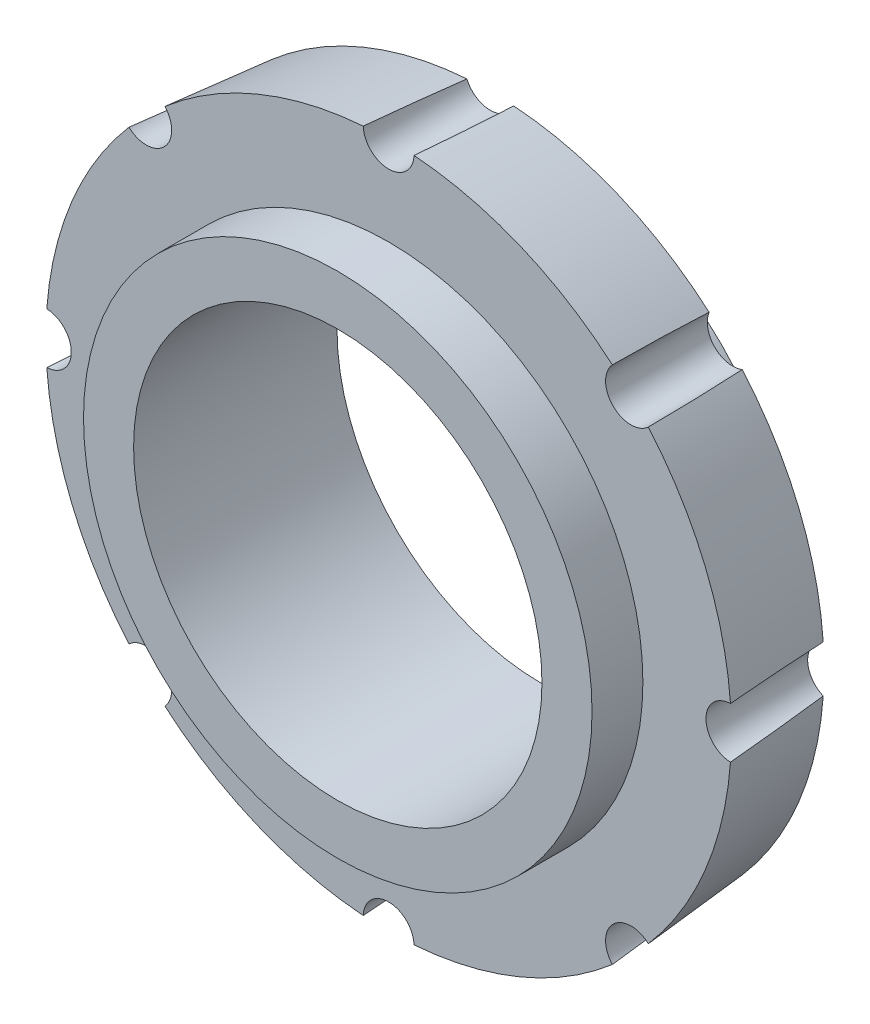
ISO-10303-21;
HEADER;
FILE_DESCRIPTION(('STEP AP214'),'2;1');
FILE_NAME('part.step','',(''),(''),'','','');
FILE_SCHEMA(('AUTOMOTIVE_DESIGN { 1 0 10303 214 1 1 1 1 }'));
ENDSEC;
DATA;
#1=APPLICATION_CONTEXT('core data for automotive mechanical design processes');
#2=APPLICATION_PROTOCOL_DEFINITION('international standard','automotive_design',2000,#1);
#3=PRODUCT_CONTEXT('',#1,'mechanical');
#4=PRODUCT('Part','Part','',(#3));
#5=PRODUCT_RELATED_PRODUCT_CATEGORY('part','',(#4));
#6=PRODUCT_DEFINITION_FORMATION('','',#4);
#7=PRODUCT_DEFINITION_CONTEXT('part definition',#1,'design');
#8=PRODUCT_DEFINITION('design','',#6,#7);
#9=PRODUCT_DEFINITION_SHAPE('','',#8);
#10=(LENGTH_UNIT() NAMED_UNIT(*) SI_UNIT(.MILLI.,.METRE.));
#11=(NAMED_UNIT(*) PLANE_ANGLE_UNIT() SI_UNIT($,.RADIAN.));
#12=(NAMED_UNIT(*) SI_UNIT($,.STERADIAN.) SOLID_ANGLE_UNIT());
#13=UNCERTAINTY_MEASURE_WITH_UNIT(LENGTH_MEASURE(1.E-05),#10,'distance_accuracy_value','');
#14=(GEOMETRIC_REPRESENTATION_CONTEXT(3) GLOBAL_UNCERTAINTY_ASSIGNED_CONTEXT((#13)) GLOBAL_UNIT_ASSIGNED_CONTEXT((#10,
#11,#12)) REPRESENTATION_CONTEXT('',''));
#15=CARTESIAN_POINT('',(0.,0.,0.));
#16=DIRECTION('',(0.,0.,1.));
#17=DIRECTION('',(1.,0.,0.));
#18=AXIS2_PLACEMENT_3D('',#15,#16,#17);
#19=CARTESIAN_POINT('',(0.,0.,-9.525));
#20=DIRECTION('',(0.,0.,1.));
#21=DIRECTION('',(1.,0.,0.));
#22=AXIS2_PLACEMENT_3D('',#19,#20,#21);
#23=CONICAL_SURFACE('',#22,20.83308,0.0891629633274056);
#24=CARTESIAN_POINT('',(0.,0.,-3.175));
#25=DIRECTION('',(0.,0.,1.));
#26=DIRECTION('',(1.,0.,0.));
#27=AXIS2_PLACEMENT_3D('',#24,#25,#26);
#28=CIRCLE('',#27,21.40077);
#29=CARTESIAN_POINT('',(13.9692354737796,16.2127547588619,-3.175));
#30=VERTEX_POINT('',#29);
#31=CARTESIAN_POINT('',(1.58640770020422,21.3418899632069,-3.175));
#32=VERTEX_POINT('',#31);
#33=EDGE_CURVE('E163',#30,#32,#28,.T.);
#34=ORIENTED_EDGE('',*,*,#33,.F.);
#35=CARTESIAN_POINT('',(13.9692476476736,16.2127678711169,-3.1748));
#36=CARTESIAN_POINT('',(13.9371745908084,16.1781990122594,-3.70190177075223));
#37=CARTESIAN_POINT('',(13.9066705156806,16.1422803863115,-4.22901091893696));
#38=CARTESIAN_POINT('',(13.8488628277287,16.0676898838869,-5.28317344568509));
#39=CARTESIAN_POINT('',(13.8215589960918,16.0290181959383,-5.81022682559679));
#40=CARTESIAN_POINT('',(13.7699972211603,15.9485311679141,-6.8686448932803));
#41=CARTESIAN_POINT('',(13.7457663809642,15.9066924416278,-7.40000913055283));
#42=CARTESIAN_POINT('',(13.7008137814249,15.8199611392416,-8.46267337602241));
#43=CARTESIAN_POINT('',(13.6800922643826,15.7750683525742,-8.99397337725553));
#44=CARTESIAN_POINT('',(13.6612252610128,15.7285537053998,-9.5252));
#45=B_SPLINE_CURVE_WITH_KNOTS('',3,(#35,#36,#37,#38,#39,#40,#41,#42,#43,#44),.UNSPECIFIED.,.F.,
.F.,(4,2,2,2,4),(0.,1.58761718683098,3.17512575888463,4.77578400100517,6.37655271536915),.UNSPECIFIED.);
#46=CARTESIAN_POINT('',(13.661232356679,15.7285712251058,-9.525));
#47=VERTEX_POINT('',#46);
#48=EDGE_CURVE('E150',#30,#47,#45,.T.);
#49=ORIENTED_EDGE('',*,*,#48,.T.);
#50=CARTESIAN_POINT('',(0.,0.,-9.525));
#51=DIRECTION('',(0.,0.,1.));
#52=DIRECTION('',(1.,0.,0.));
#53=AXIS2_PLACEMENT_3D('',#50,#51,#52);
#54=CIRCLE('',#53,20.83308);
#55=CARTESIAN_POINT('',(1.4618293328749,20.7817294104207,-9.525));
#56=VERTEX_POINT('',#55);
#57=EDGE_CURVE('E179',#47,#56,#54,.T.);
#58=ORIENTED_EDGE('',*,*,#57,.T.);
#59=CARTESIAN_POINT('',(1.46182196196561,20.7817120047241,-9.5252));
#60=CARTESIAN_POINT('',(1.48121207013453,20.827564399923,-8.99833303154652));
#61=CARTESIAN_POINT('',(1.49818324365398,20.8735786185499,-8.47139385419478));
#62=CARTESIAN_POINT('',(1.5275577605449,20.9659237664123,-7.41745193687887));
#63=CARTESIAN_POINT('',(1.53996141662278,21.012254673745,-6.89044920373798));
#64=CARTESIAN_POINT('',(1.5605582842614,21.1056167697311,-5.83203301119104));
#65=CARTESIAN_POINT('',(1.5687158496465,21.1526505813416,-5.30061909637443));
#66=CARTESIAN_POINT('',(1.58075105394653,21.2470396688961,-4.23773426527372));
#67=CARTESIAN_POINT('',(1.58462839744221,21.2943949668021,-3.70626334758684));
#68=CARTESIAN_POINT('',(1.5864083637256,21.3419078432144,-3.17479999999998));
#69=B_SPLINE_CURVE_WITH_KNOTS('',3,(#59,#60,#61,#62,#63,#64,#65,#66,#67,#68),.UNSPECIFIED.,.F.,
.F.,(4,2,2,2,4),(0.,1.58763174472737,3.17515477504854,4.77579852328264,6.37655274041472),.UNSPECIFIED.);
#70=EDGE_CURVE('E171',#56,#32,#69,.T.);
#71=ORIENTED_EDGE('',*,*,#70,.T.);
#72=EDGE_LOOP('',(#34,#49,#58,#71));
#73=FACE_BOUND('',#72,.T.);
#74=ADVANCED_FACE('F40',(#73),#23,.T.);
#75=CARTESIAN_POINT('',(20.7817294104207,1.46182933287512,-9.525));
#76=VERTEX_POINT('',#75);
#77=CARTESIAN_POINT('',(15.7285712251055,13.6612323566794,-9.525));
#78=VERTEX_POINT('',#77);
#79=EDGE_CURVE('E370',#76,#78,#54,.T.);
#80=ORIENTED_EDGE('',*,*,#79,.T.);
#81=CARTESIAN_POINT('',(15.7285537053994,13.6612252610132,-9.5252));
#82=CARTESIAN_POINT('',(15.7746871219524,13.6799369236178,-8.99833303154652));
#83=CARTESIAN_POINT('',(15.8192245198548,13.7004734577596,-8.47139385419478));
#84=CARTESIAN_POINT('',(15.9052933202056,13.7450004179351,-7.41745193687886));
#85=CARTESIAN_POINT('',(15.9468249282833,13.7689906073644,-6.89044920373798));
#86=CARTESIAN_POINT('',(16.0274060842393,13.8204433937635,-5.83203301119104));
#87=CARTESIAN_POINT('',(16.0664322811759,13.8479330510965,-5.30061909637444));
#88=CARTESIAN_POINT('',(16.1416856196292,13.9061660404028,-4.23773426527374));
#89=CARTESIAN_POINT('',(16.1779125677824,13.9369095967985,-3.70626334758685));
#90=CARTESIAN_POINT('',(16.2127678711165,13.969247647674,-3.1748));
#91=B_SPLINE_CURVE_WITH_KNOTS('',3,(#81,#82,#83,#84,#85,#86,#87,#88,#89,#90),.UNSPECIFIED.,.F.,
.F.,(4,2,2,2,4),(0.,1.58763174472737,3.17515477504854,4.77579852328264,6.3765527404147),.UNSPECIFIED.);
#92=CARTESIAN_POINT('',(16.2127547588615,13.96923547378,-3.175));
#93=VERTEX_POINT('',#92);
#94=EDGE_CURVE('E55',#78,#93,#91,.T.);
#95=ORIENTED_EDGE('',*,*,#94,.T.);
#96=CARTESIAN_POINT('',(21.3418899632069,1.58640770020444,-3.175));
#97=VERTEX_POINT('',#96);
#98=EDGE_CURVE('E167',#97,#93,#28,.T.);
#99=ORIENTED_EDGE('',*,*,#98,.F.);
#100=CARTESIAN_POINT('',(21.3419078432144,1.58640836372583,-3.17479999999998));
#101=CARTESIAN_POINT('',(21.2947848926956,1.58464356521264,-3.70190177075221));
#102=CARTESIAN_POINT('',(21.2478169503403,1.58081489961068,-4.22901091893694));
#103=CARTESIAN_POINT('',(21.1541972921082,1.56894765768964,-5.28317344568507));
#104=CARTESIAN_POINT('',(21.107545554817,1.56090936940407,-5.81022682559677));
#105=CARTESIAN_POINT('',(21.0141729507994,1.54045612679464,-6.86864489328028));
#106=CARTESIAN_POINT('',(20.9674547123097,1.52800547113792,-7.40000913055282));
#107=CARTESIAN_POINT('',(20.8743401322851,1.49846346704569,-8.46267337602241));
#108=CARTESIAN_POINT('',(20.827943813189,1.4813717983839,-8.99397337725552));
#109=CARTESIAN_POINT('',(20.7817120047241,1.46182196196583,-9.5252));
#110=B_SPLINE_CURVE_WITH_KNOTS('',3,(#100,#101,#102,#103,#104,#105,#106,#107,#108,#109),
.UNSPECIFIED.,.F.,.F.,(4,2,2,2,4),(0.,1.58761718683098,3.17512575888463,4.77578400100518,
6.37655271536917),.UNSPECIFIED.);
#111=EDGE_CURVE('E213',#97,#76,#110,.T.);
#112=ORIENTED_EDGE('',*,*,#111,.T.);
#113=EDGE_LOOP('',(#80,#95,#99,#112));
#114=FACE_BOUND('',#113,.T.);
#115=ADVANCED_FACE('F359',(#114),#23,.T.);
#116=CARTESIAN_POINT('',(15.7285712251058,-13.661232356679,-9.525));
#117=VERTEX_POINT('',#116);
#118=CARTESIAN_POINT('',(20.7817294104208,-1.46182933287468,-9.525));
#119=VERTEX_POINT('',#118);
#120=EDGE_CURVE('E212',#117,#119,#54,.T.);
#121=ORIENTED_EDGE('',*,*,#120,.T.);
#122=CARTESIAN_POINT('',(20.7817120047241,-1.46182196196539,-9.5252));
#123=CARTESIAN_POINT('',(20.827564399923,-1.48121207013431,-8.99833303154652));
#124=CARTESIAN_POINT('',(20.87357861855,-1.49818324365376,-8.47139385419478));
#125=CARTESIAN_POINT('',(20.9659237664124,-1.52755776054468,-7.41745193687887));
#126=CARTESIAN_POINT('',(21.012254673745,-1.53996141662256,-6.89044920373798));
#127=CARTESIAN_POINT('',(21.1056167697312,-1.56055828426118,-5.83203301119104));
#128=CARTESIAN_POINT('',(21.1526505813416,-1.56871584964628,-5.30061909637443));
#129=CARTESIAN_POINT('',(21.2470396688961,-1.58075105394631,-4.23773426527372));
#130=CARTESIAN_POINT('',(21.2943949668021,-1.58462839744199,-3.70626334758684));
#131=CARTESIAN_POINT('',(21.3419078432144,-1.58640836372538,-3.17479999999998));
#132=B_SPLINE_CURVE_WITH_KNOTS('',3,(#122,#123,#124,#125,#126,#127,#128,#129,#130,#131),
.UNSPECIFIED.,.F.,.F.,(4,2,2,2,4),(0.,1.58763174472737,3.17515477504854,4.77579852328265,
6.37655274041472),.UNSPECIFIED.);
#133=CARTESIAN_POINT('',(21.341889963207,-1.586407700204,-3.175));
#134=VERTEX_POINT('',#133);
#135=EDGE_CURVE('E62',#119,#134,#132,.T.);
#136=ORIENTED_EDGE('',*,*,#135,.T.);
#137=CARTESIAN_POINT('',(16.2127547588618,-13.9692354737796,-3.175));
#138=VERTEX_POINT('',#137);
#139=EDGE_CURVE('E175',#138,#134,#28,.T.);
#140=ORIENTED_EDGE('',*,*,#139,.F.);
#141=CARTESIAN_POINT('',(16.2127678711168,-13.9692476476737,-3.1748));
#142=CARTESIAN_POINT('',(16.1781990122594,-13.9371745908085,-3.70190177075223));
#143=CARTESIAN_POINT('',(16.1422803863115,-13.9066705156807,-4.22901091893696));
#144=CARTESIAN_POINT('',(16.0676898838869,-13.8488628277287,-5.28317344568509));
#145=CARTESIAN_POINT('',(16.0290181959383,-13.8215589960918,-5.8102268255968));
#146=CARTESIAN_POINT('',(15.948531167914,-13.7699972211604,-6.86864489328029));
#147=CARTESIAN_POINT('',(15.9066924416277,-13.7457663809643,-7.40000913055283));
#148=CARTESIAN_POINT('',(15.8199611392416,-13.700813781425,-8.46267337602241));
#149=CARTESIAN_POINT('',(15.7750683525741,-13.6800922643826,-8.99397337725553));
#150=CARTESIAN_POINT('',(15.7285537053997,-13.6612252610129,-9.5252));
#151=B_SPLINE_CURVE_WITH_KNOTS('',3,(#141,#142,#143,#144,#145,#146,#147,#148,#149,#150),
.UNSPECIFIED.,.F.,.F.,(4,2,2,2,4),(0.,1.58761718683098,3.17512575888463,4.77578400100517,
6.37655271536915),.UNSPECIFIED.);
#152=EDGE_CURVE('E210',#138,#117,#151,.T.);
#153=ORIENTED_EDGE('',*,*,#152,.T.);
#154=EDGE_LOOP('',(#121,#136,#140,#153));
#155=FACE_BOUND('',#154,.T.);
#156=ADVANCED_FACE('F209',(#155),#23,.T.);
#157=CARTESIAN_POINT('',(1.46182933287505,-20.7817294104207,-9.525));
#158=VERTEX_POINT('',#157);
#159=CARTESIAN_POINT('',(13.6612323566793,-15.7285712251055,-9.525));
#160=VERTEX_POINT('',#159);
#161=EDGE_CURVE('E371',#158,#160,#54,.T.);
#162=ORIENTED_EDGE('',*,*,#161,.T.);
#163=CARTESIAN_POINT('',(13.6612252610131,-15.7285537053995,-9.5252));
#164=CARTESIAN_POINT('',(13.6799369236177,-15.7746871219524,-8.99833303154652));
#165=CARTESIAN_POINT('',(13.7004734577595,-15.8192245198549,-8.47139385419478));
#166=CARTESIAN_POINT('',(13.7450004179351,-15.9052933202057,-7.41745193687887));
#167=CARTESIAN_POINT('',(13.7689906073644,-15.9468249282833,-6.89044920373798));
#168=CARTESIAN_POINT('',(13.8204433937635,-16.0274060842394,-5.83203301119104));
#169=CARTESIAN_POINT('',(13.8479330510965,-16.066432281176,-5.30061909637443));
#170=CARTESIAN_POINT('',(13.9061660404028,-16.1416856196293,-4.23773426527372));
#171=CARTESIAN_POINT('',(13.9369095967984,-16.1779125677825,-3.70626334758684));
#172=CARTESIAN_POINT('',(13.969247647674,-16.2127678711166,-3.17479999999998));
#173=B_SPLINE_CURVE_WITH_KNOTS('',3,(#163,#164,#165,#166,#167,#168,#169,#170,#171,#172),
.UNSPECIFIED.,.F.,.F.,(4,2,2,2,4),(0.,1.58763174472737,3.17515477504854,4.77579852328265,
6.37655274041472),.UNSPECIFIED.);
#174=CARTESIAN_POINT('',(13.9692354737799,-16.2127547588616,-3.175));
#175=VERTEX_POINT('',#174);
#176=EDGE_CURVE('E248',#160,#175,#173,.T.);
#177=ORIENTED_EDGE('',*,*,#176,.T.);
#178=CARTESIAN_POINT('',(1.58640770020437,-21.3418899632069,-3.175));
#179=VERTEX_POINT('',#178);
#180=EDGE_CURVE('E197',#179,#175,#28,.T.);
#181=ORIENTED_EDGE('',*,*,#180,.F.);
#182=CARTESIAN_POINT('',(1.58640836372575,-21.3419078432144,-3.17479999999998));
#183=CARTESIAN_POINT('',(1.58464356521256,-21.2947848926956,-3.70190177075221));
#184=CARTESIAN_POINT('',(1.58081489961061,-21.2478169503403,-4.22901091893694));
#185=CARTESIAN_POINT('',(1.56894765768957,-21.1541972921082,-5.28317344568507));
#186=CARTESIAN_POINT('',(1.560909369404,-21.107545554817,-5.81022682559677));
#187=CARTESIAN_POINT('',(1.54045612679457,-21.0141729507994,-6.86864489328028));
#188=CARTESIAN_POINT('',(1.52800547113785,-20.9674547123097,-7.40000913055281));
#189=CARTESIAN_POINT('',(1.49846346704561,-20.8743401322851,-8.4626733760224));
#190=CARTESIAN_POINT('',(1.48137179838383,-20.827943813189,-8.99397337725552));
#191=CARTESIAN_POINT('',(1.46182196196576,-20.7817120047241,-9.5252));
#192=B_SPLINE_CURVE_WITH_KNOTS('',3,(#182,#183,#184,#185,#186,#187,#188,#189,#190,#191),
.UNSPECIFIED.,.F.,.F.,(4,2,2,2,4),(0.,1.58761718683098,3.17512575888463,4.77578400100518,
6.37655271536917),.UNSPECIFIED.);
#193=EDGE_CURVE('E265',#179,#158,#192,.T.);
#194=ORIENTED_EDGE('',*,*,#193,.T.);
#195=EDGE_LOOP('',(#162,#177,#181,#194));
#196=FACE_BOUND('',#195,.T.);
#197=ADVANCED_FACE('F367',(#196),#23,.T.);
#198=CARTESIAN_POINT('',(-13.6612323566791,-15.7285712251057,-9.525));
#199=VERTEX_POINT('',#198);
#200=CARTESIAN_POINT('',(-1.46182933287476,-20.7817294104208,-9.525));
#201=VERTEX_POINT('',#200);
#202=EDGE_CURVE('E411',#199,#201,#54,.T.);
#203=ORIENTED_EDGE('',*,*,#202,.T.);
#204=CARTESIAN_POINT('',(-1.46182196196547,-20.7817120047241,-9.5252));
#205=CARTESIAN_POINT('',(-1.48121207013438,-20.827564399923,-8.99833303154652));
#206=CARTESIAN_POINT('',(-1.49818324365383,-20.8735786185499,-8.47139385419478));
#207=CARTESIAN_POINT('',(-1.52755776054476,-20.9659237664124,-7.41745193687887));
#208=CARTESIAN_POINT('',(-1.53996141662263,-21.012254673745,-6.89044920373798));
#209=CARTESIAN_POINT('',(-1.56055828426125,-21.1056167697311,-5.83203301119104));
#210=CARTESIAN_POINT('',(-1.56871584964636,-21.1526505813416,-5.30061909637443));
#211=CARTESIAN_POINT('',(-1.58075105394638,-21.2470396688961,-4.23773426527372));
#212=CARTESIAN_POINT('',(-1.58462839744206,-21.2943949668021,-3.70626334758684));
#213=CARTESIAN_POINT('',(-1.58640836372545,-21.3419078432144,-3.17479999999998));
#214=B_SPLINE_CURVE_WITH_KNOTS('',3,(#204,#205,#206,#207,#208,#209,#210,#211,#212,#213),
.UNSPECIFIED.,.F.,.F.,(4,2,2,2,4),(0.,1.58763174472737,3.17515477504854,4.77579852328265,
6.37655274041472),.UNSPECIFIED.);
#215=CARTESIAN_POINT('',(-1.58640770020407,-21.3418899632069,-3.175));
#216=VERTEX_POINT('',#215);
#217=EDGE_CURVE('E259',#201,#216,#214,.T.);
#218=ORIENTED_EDGE('',*,*,#217,.T.);
#219=CARTESIAN_POINT('',(-13.9692354737797,-16.2127547588618,-3.175));
#220=VERTEX_POINT('',#219);
#221=EDGE_CURVE('E193',#220,#216,#28,.T.);
#222=ORIENTED_EDGE('',*,*,#221,.F.);
#223=CARTESIAN_POINT('',(-13.9692476476738,-16.2127678711168,-3.17479999999998));
#224=CARTESIAN_POINT('',(-13.9371745908085,-16.1781990122593,-3.70190177075221));
#225=CARTESIAN_POINT('',(-13.9066705156807,-16.1422803863115,-4.22901091893694));
#226=CARTESIAN_POINT('',(-13.8488628277288,-16.0676898838868,-5.28317344568506));
#227=CARTESIAN_POINT('',(-13.8215589960919,-16.0290181959382,-5.81022682559677));
#228=CARTESIAN_POINT('',(-13.7699972211604,-15.948531167914,-6.86864489328028));
#229=CARTESIAN_POINT('',(-13.7457663809643,-15.9066924416277,-7.40000913055281));
#230=CARTESIAN_POINT('',(-13.700813781425,-15.8199611392415,-8.46267337602241));
#231=CARTESIAN_POINT('',(-13.6800922643827,-15.7750683525741,-8.99397337725552));
#232=CARTESIAN_POINT('',(-13.6612252610129,-15.7285537053997,-9.5252));
#233=B_SPLINE_CURVE_WITH_KNOTS('',3,(#223,#224,#225,#226,#227,#228,#229,#230,#231,#232),
.UNSPECIFIED.,.F.,.F.,(4,2,2,2,4),(0.,1.58761718683098,3.17512575888463,4.77578400100518,
6.37655271536918),.UNSPECIFIED.);
#234=EDGE_CURVE('E279',#220,#199,#233,.T.);
#235=ORIENTED_EDGE('',*,*,#234,.T.);
#236=EDGE_LOOP('',(#203,#218,#222,#235));
#237=FACE_BOUND('',#236,.T.);
#238=ADVANCED_FACE('F490',(#237),#23,.T.);
#239=CARTESIAN_POINT('',(-20.7817294104207,-1.46182933287497,-9.525));
#240=VERTEX_POINT('',#239);
#241=CARTESIAN_POINT('',(-15.7285712251056,-13.6612323566793,-9.525));
#242=VERTEX_POINT('',#241);
#243=EDGE_CURVE('E413',#240,#242,#54,.T.);
#244=ORIENTED_EDGE('',*,*,#243,.T.);
#245=CARTESIAN_POINT('',(-15.7285537053995,-13.6612252610131,-9.5252));
#246=CARTESIAN_POINT('',(-15.7746871219525,-13.6799369236177,-8.99833303154652));
#247=CARTESIAN_POINT('',(-15.8192245198549,-13.7004734577595,-8.47139385419478));
#248=CARTESIAN_POINT('',(-15.9052933202057,-13.745000417935,-7.41745193687887));
#249=CARTESIAN_POINT('',(-15.9468249282834,-13.7689906073643,-6.89044920373798));
#250=CARTESIAN_POINT('',(-16.0274060842394,-13.8204433937634,-5.83203301119104));
#251=CARTESIAN_POINT('',(-16.066432281176,-13.8479330510964,-5.30061909637443));
#252=CARTESIAN_POINT('',(-16.1416856196293,-13.9061660404027,-4.23773426527372));
#253=CARTESIAN_POINT('',(-16.1779125677825,-13.9369095967984,-3.70626334758684));
#254=CARTESIAN_POINT('',(-16.2127678711166,-13.9692476476739,-3.17479999999998));
#255=B_SPLINE_CURVE_WITH_KNOTS('',3,(#245,#246,#247,#248,#249,#250,#251,#252,#253,#254),
.UNSPECIFIED.,.F.,.F.,(4,2,2,2,4),(0.,1.58763174472737,3.17515477504854,4.77579852328265,
6.37655274041472),.UNSPECIFIED.);
#256=CARTESIAN_POINT('',(-16.2127547588616,-13.9692354737799,-3.175));
#257=VERTEX_POINT('',#256);
#258=EDGE_CURVE('E273',#242,#257,#255,.T.);
#259=ORIENTED_EDGE('',*,*,#258,.T.);
#260=CARTESIAN_POINT('',(-21.3418899632069,-1.5864077002043,-3.175));
#261=VERTEX_POINT('',#260);
#262=EDGE_CURVE('E189',#261,#257,#28,.T.);
#263=ORIENTED_EDGE('',*,*,#262,.F.);
#264=CARTESIAN_POINT('',(-21.3419078432144,-1.58640836372568,-3.17479999999998));
#265=CARTESIAN_POINT('',(-21.2947848926956,-1.58464356521249,-3.70190177075221));
#266=CARTESIAN_POINT('',(-21.2478169503403,-1.58081489961053,-4.22901091893694));
#267=CARTESIAN_POINT('',(-21.1541972921082,-1.56894765768949,-5.28317344568507));
#268=CARTESIAN_POINT('',(-21.107545554817,-1.56090936940393,-5.81022682559677));
#269=CARTESIAN_POINT('',(-21.0141729507994,-1.5404561267945,-6.86864489328028));
#270=CARTESIAN_POINT('',(-20.9674547123097,-1.52800547113778,-7.40000913055281));
#271=CARTESIAN_POINT('',(-20.8743401322851,-1.49846346704554,-8.46267337602241));
#272=CARTESIAN_POINT('',(-20.8279438131891,-1.48137179838376,-8.99397337725552));
#273=CARTESIAN_POINT('',(-20.7817120047241,-1.46182196196568,-9.5252));
#274=B_SPLINE_CURVE_WITH_KNOTS('',3,(#264,#265,#266,#267,#268,#269,#270,#271,#272,#273),
.UNSPECIFIED.,.F.,.F.,(4,2,2,2,4),(0.,1.58761718683098,3.17512575888463,4.77578400100518,
6.37655271536917),.UNSPECIFIED.);
#275=EDGE_CURVE('E305',#261,#240,#274,.T.);
#276=ORIENTED_EDGE('',*,*,#275,.T.);
#277=EDGE_LOOP('',(#244,#259,#263,#276));
#278=FACE_BOUND('',#277,.T.);
#279=ADVANCED_FACE('F497',(#278),#23,.T.);
#280=CARTESIAN_POINT('',(-15.7285712251057,13.6612323566791,-9.525));
#281=VERTEX_POINT('',#280);
#282=CARTESIAN_POINT('',(-20.7817294104207,1.46182933287483,-9.525));
#283=VERTEX_POINT('',#282);
#284=EDGE_CURVE('E177',#281,#283,#54,.T.);
#285=ORIENTED_EDGE('',*,*,#284,.T.);
#286=CARTESIAN_POINT('',(-20.7817120047241,1.46182196196554,-9.5252));
#287=CARTESIAN_POINT('',(-20.827564399923,1.48121207013445,-8.99833303154652));
#288=CARTESIAN_POINT('',(-20.8735786185499,1.4981832436539,-8.47139385419478));
#289=CARTESIAN_POINT('',(-20.9659237664124,1.52755776054483,-7.41745193687887));
#290=CARTESIAN_POINT('',(-21.012254673745,1.5399614166227,-6.89044920373798));
#291=CARTESIAN_POINT('',(-21.1056167697311,1.56055828426132,-5.83203301119104));
#292=CARTESIAN_POINT('',(-21.1526505813416,1.56871584964643,-5.30061909637443));
#293=CARTESIAN_POINT('',(-21.2470396688961,1.58075105394645,-4.23773426527372));
#294=CARTESIAN_POINT('',(-21.2943949668021,1.58462839744214,-3.70626334758684));
#295=CARTESIAN_POINT('',(-21.3419078432144,1.58640836372553,-3.17479999999998));
#296=B_SPLINE_CURVE_WITH_KNOTS('',3,(#286,#287,#288,#289,#290,#291,#292,#293,#294,#295),
.UNSPECIFIED.,.F.,.F.,(4,2,2,2,4),(0.,1.58763174472737,3.17515477504854,4.77579852328265,
6.37655274041472),.UNSPECIFIED.);
#297=CARTESIAN_POINT('',(-21.3418899632069,1.58640770020415,-3.175));
#298=VERTEX_POINT('',#297);
#299=EDGE_CURVE('E300',#283,#298,#296,.T.);
#300=ORIENTED_EDGE('',*,*,#299,.T.);
#301=CARTESIAN_POINT('',(-16.2127547588617,13.9692354737797,-3.175));
#302=VERTEX_POINT('',#301);
#303=EDGE_CURVE('E183',#302,#298,#28,.T.);
#304=ORIENTED_EDGE('',*,*,#303,.F.);
#305=CARTESIAN_POINT('',(-16.2127678711167,13.9692476476738,-3.17479999999998));
#306=CARTESIAN_POINT('',(-16.1781990122593,13.9371745908086,-3.70190177075221));
#307=CARTESIAN_POINT('',(-16.1422803863114,13.9066705156808,-4.22901091893694));
#308=CARTESIAN_POINT('',(-16.0676898838868,13.8488628277288,-5.28317344568507));
#309=CARTESIAN_POINT('',(-16.0290181959382,13.821558996092,-5.81022682559677));
#310=CARTESIAN_POINT('',(-15.9485311679139,13.7699972211605,-6.86864489328028));
#311=CARTESIAN_POINT('',(-15.9066924416277,13.7457663809644,-7.40000913055281));
#312=CARTESIAN_POINT('',(-15.8199611392415,13.7008137814251,-8.4626733760224));
#313=CARTESIAN_POINT('',(-15.775068352574,13.6800922643827,-8.99397337725552));
#314=CARTESIAN_POINT('',(-15.7285537053996,13.661225261013,-9.5252));
#315=B_SPLINE_CURVE_WITH_KNOTS('',3,(#305,#306,#307,#308,#309,#310,#311,#312,#313,#314),
.UNSPECIFIED.,.F.,.F.,(4,2,2,2,4),(0.,1.58761718683098,3.17512575888463,4.77578400100518,
6.37655271536917),.UNSPECIFIED.);
#316=EDGE_CURVE('E319',#302,#281,#315,.T.);
#317=ORIENTED_EDGE('',*,*,#316,.T.);
#318=EDGE_LOOP('',(#285,#300,#304,#317));
#319=FACE_BOUND('',#318,.T.);
#320=ADVANCED_FACE('F356',(#319),#23,.T.);
#321=CARTESIAN_POINT('',(0.,0.,0.));
#322=DIRECTION('',(0.,0.,1.));
#323=DIRECTION('',(1.,0.,0.));
#324=AXIS2_PLACEMENT_3D('',#321,#322,#323);
#325=CYLINDRICAL_SURFACE('',#324,12.74826);
#326=CARTESIAN_POINT('',(0.,0.,-12.7));
#327=DIRECTION('',(0.,0.,1.));
#328=DIRECTION('',(1.,0.,0.));
#329=AXIS2_PLACEMENT_3D('',#326,#327,#328);
#330=CIRCLE('',#329,12.74826);
#331=CARTESIAN_POINT('',(12.74826,0.,-12.7));
#332=VERTEX_POINT('',#331);
#333=EDGE_CURVE('E378',#332,#332,#330,.T.);
#334=ORIENTED_EDGE('',*,*,#333,.F.);
#335=EDGE_LOOP('',(#334));
#336=FACE_BOUND('',#335,.T.);
#337=CARTESIAN_POINT('',(0.,0.,0.));
#338=DIRECTION('',(0.,0.,1.));
#339=DIRECTION('',(1.,0.,0.));
#340=AXIS2_PLACEMENT_3D('',#337,#338,#339);
#341=CIRCLE('',#340,12.74826);
#342=CARTESIAN_POINT('',(12.74826,0.,0.));
#343=VERTEX_POINT('',#342);
#344=EDGE_CURVE('E396',#343,#343,#341,.T.);
#345=ORIENTED_EDGE('',*,*,#344,.T.);
#346=EDGE_LOOP('',(#345));
#347=FACE_BOUND('',#346,.T.);
#348=ADVANCED_FACE('F42',(#336,#347),#325,.F.);
#349=CARTESIAN_POINT('',(0.,15.875,0.));
#350=DIRECTION('',(0.,0.,-1.));
#351=DIRECTION('',(-1.,0.,0.));
#352=AXIS2_PLACEMENT_3D('',#349,#350,#351);
#353=PLANE('',#352);
#354=ORIENTED_EDGE('',*,*,#344,.F.);
#355=EDGE_LOOP('',(#354));
#356=FACE_BOUND('',#355,.T.);
#357=CARTESIAN_POINT('',(0.,0.,0.));
#358=DIRECTION('',(0.,0.,1.));
#359=DIRECTION('',(1.,0.,0.));
#360=AXIS2_PLACEMENT_3D('',#357,#358,#359);
#361=CIRCLE('',#360,15.875);
#362=CARTESIAN_POINT('',(15.875,0.,0.));
#363=VERTEX_POINT('',#362);
#364=EDGE_CURVE('E187',#363,#363,#361,.T.);
#365=ORIENTED_EDGE('',*,*,#364,.T.);
#366=EDGE_LOOP('',(#365));
#367=FACE_BOUND('',#366,.T.);
#368=ADVANCED_FACE('F547',(#356,#367),#353,.F.);
#369=CARTESIAN_POINT('',(0.,0.,0.));
#370=DIRECTION('',(0.,0.,1.));
#371=DIRECTION('',(1.,0.,0.));
#372=AXIS2_PLACEMENT_3D('',#369,#370,#371);
#373=CYLINDRICAL_SURFACE('',#372,15.875);
#374=ORIENTED_EDGE('',*,*,#364,.F.);
#375=EDGE_LOOP('',(#374));
#376=FACE_BOUND('',#375,.T.);
#377=CARTESIAN_POINT('',(0.,0.,-3.175));
#378=DIRECTION('',(0.,0.,1.));
#379=DIRECTION('',(1.,0.,0.));
#380=AXIS2_PLACEMENT_3D('',#377,#378,#379);
#381=CIRCLE('',#380,15.875);
#382=CARTESIAN_POINT('',(15.875,0.,-3.175));
#383=VERTEX_POINT('',#382);
#384=EDGE_CURVE('E182',#383,#383,#381,.T.);
#385=ORIENTED_EDGE('',*,*,#384,.T.);
#386=EDGE_LOOP('',(#385));
#387=FACE_BOUND('',#386,.T.);
#388=ADVANCED_FACE('F540',(#376,#387),#373,.T.);
#389=CARTESIAN_POINT('',(0.,15.875,-3.175));
#390=DIRECTION('',(0.,0.,-1.));
#391=DIRECTION('',(-1.,0.,0.));
#392=AXIS2_PLACEMENT_3D('',#389,#390,#391);
#393=PLANE('',#392);
#394=ORIENTED_EDGE('',*,*,#384,.F.);
#395=EDGE_LOOP('',(#394));
#396=FACE_BOUND('',#395,.T.);
#397=ORIENTED_EDGE('',*,*,#98,.T.);
#398=CARTESIAN_POINT('',(15.1326295896134,15.1326295896138,-3.175));
#399=DIRECTION('',(0.,0.,1.));
#400=DIRECTION('',(0.707106781186556,-0.707106781186539,0.));
#401=AXIS2_PLACEMENT_3D('',#398,#399,#400);
#402=CIRCLE('',#401,1.5875);
#403=EDGE_CURVE('E153',#30,#93,#402,.T.);
#404=ORIENTED_EDGE('',*,*,#403,.F.);
#405=ORIENTED_EDGE('',*,*,#33,.T.);
#406=CARTESIAN_POINT('',(0.,21.40077,-3.175));
#407=DIRECTION('',(0.,0.,1.));
#408=DIRECTION('',(1.,0.,0.));
#409=AXIS2_PLACEMENT_3D('',#406,#407,#408);
#410=CIRCLE('',#409,1.5875);
#411=CARTESIAN_POINT('',(-1.58640770020422,21.3418899632069,-3.175));
#412=VERTEX_POINT('',#411);
#413=EDGE_CURVE('E325',#412,#32,#410,.T.);
#414=ORIENTED_EDGE('',*,*,#413,.F.);
#415=CARTESIAN_POINT('',(-13.9692354737798,16.2127547588617,-3.175));
#416=VERTEX_POINT('',#415);
#417=EDGE_CURVE('E174',#412,#416,#28,.T.);
#418=ORIENTED_EDGE('',*,*,#417,.T.);
#419=CARTESIAN_POINT('',(-15.1326295896137,15.1326295896136,-3.175));
#420=DIRECTION('',(0.,0.,1.));
#421=DIRECTION('',(0.707106781186546,0.707106781186549,0.));
#422=AXIS2_PLACEMENT_3D('',#419,#420,#421);
#423=CIRCLE('',#422,1.5875);
#424=EDGE_CURVE('E311',#302,#416,#423,.T.);
#425=ORIENTED_EDGE('',*,*,#424,.F.);
#426=ORIENTED_EDGE('',*,*,#303,.T.);
#427=CARTESIAN_POINT('',(-21.40077,0.,-3.175));
#428=DIRECTION('',(0.,0.,1.));
#429=DIRECTION('',(0.,1.,0.));
#430=AXIS2_PLACEMENT_3D('',#427,#428,#429);
#431=CIRCLE('',#430,1.5875);
#432=EDGE_CURVE('E586',#261,#298,#431,.T.);
#433=ORIENTED_EDGE('',*,*,#432,.F.);
#434=ORIENTED_EDGE('',*,*,#262,.T.);
#435=CARTESIAN_POINT('',(-15.1326295896136,-15.1326295896137,-3.175));
#436=DIRECTION('',(0.,0.,1.));
#437=DIRECTION('',(-0.707106781186551,0.707106781186544,0.));
#438=AXIS2_PLACEMENT_3D('',#435,#436,#437);
#439=CIRCLE('',#438,1.5875);
#440=EDGE_CURVE('E271',#220,#257,#439,.T.);
#441=ORIENTED_EDGE('',*,*,#440,.F.);
#442=ORIENTED_EDGE('',*,*,#221,.T.);
#443=CARTESIAN_POINT('',(1.49440864739858E-13,-21.40077,-3.175));
#444=DIRECTION('',(0.,0.,1.));
#445=DIRECTION('',(-1.,0.,0.));
#446=AXIS2_PLACEMENT_3D('',#443,#444,#445);
#447=CIRCLE('',#446,1.5875);
#448=EDGE_CURVE('E257',#179,#216,#447,.T.);
#449=ORIENTED_EDGE('',*,*,#448,.F.);
#450=ORIENTED_EDGE('',*,*,#180,.T.);
#451=CARTESIAN_POINT('',(15.1326295896138,-15.1326295896135,-3.175));
#452=DIRECTION('',(0.,0.,1.));
#453=DIRECTION('',(-0.707106781186541,-0.707106781186554,0.));
#454=AXIS2_PLACEMENT_3D('',#451,#452,#453);
#455=CIRCLE('',#454,1.5875);
#456=EDGE_CURVE('E205',#138,#175,#455,.T.);
#457=ORIENTED_EDGE('',*,*,#456,.F.);
#458=ORIENTED_EDGE('',*,*,#139,.T.);
#459=CARTESIAN_POINT('',(21.40077,2.24161297109787E-13,-3.175));
#460=DIRECTION('',(0.,0.,1.));
#461=DIRECTION('',(0.,-1.,0.));
#462=AXIS2_PLACEMENT_3D('',#459,#460,#461);
#463=CIRCLE('',#462,1.5875);
#464=EDGE_CURVE('E157',#97,#134,#463,.T.);
#465=ORIENTED_EDGE('',*,*,#464,.F.);
#466=EDGE_LOOP('',(#397,#404,#405,#414,#418,#425,#426,#433,#434,#441,#442,#449,#450,#457,#458,#465));
#467=FACE_BOUND('',#466,.T.);
#468=ADVANCED_FACE('F161',(#396,#467),#393,.F.);
#469=CARTESIAN_POINT('',(-1.4618293328749,20.7817294104207,-9.525));
#470=VERTEX_POINT('',#469);
#471=CARTESIAN_POINT('',(-13.6612323566792,15.7285712251056,-9.525));
#472=VERTEX_POINT('',#471);
#473=EDGE_CURVE('E172',#470,#472,#54,.T.);
#474=ORIENTED_EDGE('',*,*,#473,.T.);
#475=CARTESIAN_POINT('',(-13.661225261013,15.7285537053996,-9.5252));
#476=CARTESIAN_POINT('',(-13.6799369236176,15.7746871219525,-8.99833303154652));
#477=CARTESIAN_POINT('',(-13.7004734577594,15.819224519855,-8.47139385419478));
#478=CARTESIAN_POINT('',(-13.745000417935,15.9052933202058,-7.41745193687887));
#479=CARTESIAN_POINT('',(-13.7689906073643,15.9468249282834,-6.89044920373798));
#480=CARTESIAN_POINT('',(-13.8204433937634,16.0274060842395,-5.83203301119104));
#481=CARTESIAN_POINT('',(-13.8479330510964,16.066432281176,-5.30061909637443));
#482=CARTESIAN_POINT('',(-13.9061660404027,16.1416856196294,-4.23773426527374));
#483=CARTESIAN_POINT('',(-13.9369095967983,16.1779125677826,-3.70626334758685));
#484=CARTESIAN_POINT('',(-13.9692476476739,16.2127678711167,-3.1748));
#485=B_SPLINE_CURVE_WITH_KNOTS('',3,(#475,#476,#477,#478,#479,#480,#481,#482,#483,#484),
.UNSPECIFIED.,.F.,.F.,(4,2,2,2,4),(0.,1.58763174472737,3.17515477504854,4.77579852328264,
6.3765527404147),.UNSPECIFIED.);
#486=EDGE_CURVE('E313',#472,#416,#485,.T.);
#487=ORIENTED_EDGE('',*,*,#486,.T.);
#488=ORIENTED_EDGE('',*,*,#417,.F.);
#489=CARTESIAN_POINT('',(-1.5864083637256,21.3419078432144,-3.17479999999998));
#490=CARTESIAN_POINT('',(-1.58464356521241,21.2947848926956,-3.70190177075221));
#491=CARTESIAN_POINT('',(-1.58081489961046,21.2478169503403,-4.22901091893694));
#492=CARTESIAN_POINT('',(-1.56894765768942,21.1541972921082,-5.28317344568507));
#493=CARTESIAN_POINT('',(-1.56090936940385,21.107545554817,-5.81022682559677));
#494=CARTESIAN_POINT('',(-1.54045612679442,21.0141729507994,-6.86864489328028));
#495=CARTESIAN_POINT('',(-1.52800547113771,20.9674547123097,-7.40000913055281));
#496=CARTESIAN_POINT('',(-1.49846346704547,20.8743401322851,-8.46267337602241));
#497=CARTESIAN_POINT('',(-1.48137179838369,20.8279438131891,-8.99397337725552));
#498=CARTESIAN_POINT('',(-1.46182196196561,20.7817120047241,-9.5252));
#499=B_SPLINE_CURVE_WITH_KNOTS('',3,(#489,#490,#491,#492,#493,#494,#495,#496,#497,#498),
.UNSPECIFIED.,.F.,.F.,(4,2,2,2,4),(0.,1.58761718683098,3.17512575888463,4.77578400100518,
6.37655271536917),.UNSPECIFIED.);
#500=EDGE_CURVE('E331',#412,#470,#499,.T.);
#501=ORIENTED_EDGE('',*,*,#500,.T.);
#502=EDGE_LOOP('',(#474,#487,#488,#501));
#503=FACE_BOUND('',#502,.T.);
#504=ADVANCED_FACE('F227',(#503),#23,.T.);
#505=CARTESIAN_POINT('',(0.,20.83308,-9.525));
#506=DIRECTION('',(0.,0.,1.));
#507=DIRECTION('',(1.,0.,0.));
#508=AXIS2_PLACEMENT_3D('',#505,#506,#507);
#509=PLANE('',#508);
#510=ORIENTED_EDGE('',*,*,#57,.F.);
#511=CARTESIAN_POINT('',(15.1326295896134,15.1326295896138,-9.525));
#512=DIRECTION('',(0.,0.,1.));
#513=DIRECTION('',(1.,0.,0.));
#514=AXIS2_PLACEMENT_3D('',#511,#512,#513);
#515=CIRCLE('',#514,1.5875);
#516=EDGE_CURVE('E11',#47,#78,#515,.T.);
#517=ORIENTED_EDGE('',*,*,#516,.T.);
#518=ORIENTED_EDGE('',*,*,#79,.F.);
#519=CARTESIAN_POINT('',(21.40077,2.24161297109787E-13,-9.525));
#520=DIRECTION('',(0.,0.,1.));
#521=DIRECTION('',(1.,0.,0.));
#522=AXIS2_PLACEMENT_3D('',#519,#520,#521);
#523=CIRCLE('',#522,1.5875);
#524=EDGE_CURVE('E48',#76,#119,#523,.T.);
#525=ORIENTED_EDGE('',*,*,#524,.T.);
#526=ORIENTED_EDGE('',*,*,#120,.F.);
#527=CARTESIAN_POINT('',(15.1326295896138,-15.1326295896135,-9.525));
#528=DIRECTION('',(0.,0.,1.));
#529=DIRECTION('',(1.,0.,0.));
#530=AXIS2_PLACEMENT_3D('',#527,#528,#529);
#531=CIRCLE('',#530,1.5875);
#532=EDGE_CURVE('E405',#117,#160,#531,.T.);
#533=ORIENTED_EDGE('',*,*,#532,.T.);
#534=ORIENTED_EDGE('',*,*,#161,.F.);
#535=CARTESIAN_POINT('',(1.49440864739858E-13,-21.40077,-9.525));
#536=DIRECTION('',(0.,0.,1.));
#537=DIRECTION('',(1.,0.,0.));
#538=AXIS2_PLACEMENT_3D('',#535,#536,#537);
#539=CIRCLE('',#538,1.5875);
#540=EDGE_CURVE('E402',#158,#201,#539,.T.);
#541=ORIENTED_EDGE('',*,*,#540,.T.);
#542=ORIENTED_EDGE('',*,*,#202,.F.);
#543=CARTESIAN_POINT('',(-15.1326295896136,-15.1326295896137,-9.525));
#544=DIRECTION('',(0.,0.,1.));
#545=DIRECTION('',(1.,0.,0.));
#546=AXIS2_PLACEMENT_3D('',#543,#544,#545);
#547=CIRCLE('',#546,1.5875);
#548=EDGE_CURVE('E394',#199,#242,#547,.T.);
#549=ORIENTED_EDGE('',*,*,#548,.T.);
#550=ORIENTED_EDGE('',*,*,#243,.F.);
#551=CARTESIAN_POINT('',(-21.40077,0.,-9.525));
#552=DIRECTION('',(0.,0.,1.));
#553=DIRECTION('',(1.,0.,0.));
#554=AXIS2_PLACEMENT_3D('',#551,#552,#553);
#555=CIRCLE('',#554,1.5875);
#556=EDGE_CURVE('E392',#240,#283,#555,.T.);
#557=ORIENTED_EDGE('',*,*,#556,.T.);
#558=ORIENTED_EDGE('',*,*,#284,.F.);
#559=CARTESIAN_POINT('',(-15.1326295896137,15.1326295896136,-9.525));
#560=DIRECTION('',(0.,0.,1.));
#561=DIRECTION('',(1.,0.,0.));
#562=AXIS2_PLACEMENT_3D('',#559,#560,#561);
#563=CIRCLE('',#562,1.5875);
#564=EDGE_CURVE('E388',#281,#472,#563,.T.);
#565=ORIENTED_EDGE('',*,*,#564,.T.);
#566=ORIENTED_EDGE('',*,*,#473,.F.);
#567=CARTESIAN_POINT('',(0.,21.40077,-9.525));
#568=DIRECTION('',(0.,0.,1.));
#569=DIRECTION('',(1.,0.,0.));
#570=AXIS2_PLACEMENT_3D('',#567,#568,#569);
#571=CIRCLE('',#570,1.5875);
#572=EDGE_CURVE('E386',#470,#56,#571,.T.);
#573=ORIENTED_EDGE('',*,*,#572,.T.);
#574=EDGE_LOOP('',(#510,#517,#518,#525,#526,#533,#534,#541,#542,#549,#550,#557,#558,#565,#566,#573));
#575=FACE_BOUND('',#574,.T.);
#576=CARTESIAN_POINT('',(0.,0.,-9.525));
#577=DIRECTION('',(0.,0.,1.));
#578=DIRECTION('',(1.,0.,0.));
#579=AXIS2_PLACEMENT_3D('',#576,#577,#578);
#580=CIRCLE('',#579,15.875);
#581=CARTESIAN_POINT('',(15.875,0.,-9.525));
#582=VERTEX_POINT('',#581);
#583=EDGE_CURVE('E372',#582,#582,#580,.T.);
#584=ORIENTED_EDGE('',*,*,#583,.T.);
#585=EDGE_LOOP('',(#584));
#586=FACE_BOUND('',#585,.T.);
#587=ADVANCED_FACE('F348',(#575,#586),#509,.F.);
#588=CARTESIAN_POINT('',(0.,0.,0.));
#589=DIRECTION('',(0.,0.,1.));
#590=DIRECTION('',(1.,0.,0.));
#591=AXIS2_PLACEMENT_3D('',#588,#589,#590);
#592=CYLINDRICAL_SURFACE('',#591,15.875);
#593=ORIENTED_EDGE('',*,*,#583,.F.);
#594=EDGE_LOOP('',(#593));
#595=FACE_BOUND('',#594,.T.);
#596=CARTESIAN_POINT('',(0.,0.,-12.7));
#597=DIRECTION('',(0.,0.,1.));
#598=DIRECTION('',(1.,0.,0.));
#599=AXIS2_PLACEMENT_3D('',#596,#597,#598);
#600=CIRCLE('',#599,15.875);
#601=CARTESIAN_POINT('',(15.875,0.,-12.7));
#602=VERTEX_POINT('',#601);
#603=EDGE_CURVE('E376',#602,#602,#600,.T.);
#604=ORIENTED_EDGE('',*,*,#603,.T.);
#605=EDGE_LOOP('',(#604));
#606=FACE_BOUND('',#605,.T.);
#607=ADVANCED_FACE('F345',(#595,#606),#592,.T.);
#608=CARTESIAN_POINT('',(0.,15.875,-12.7));
#609=DIRECTION('',(0.,0.,1.));
#610=DIRECTION('',(1.,0.,0.));
#611=AXIS2_PLACEMENT_3D('',#608,#609,#610);
#612=PLANE('',#611);
#613=ORIENTED_EDGE('',*,*,#603,.F.);
#614=EDGE_LOOP('',(#613));
#615=FACE_BOUND('',#614,.T.);
#616=ORIENTED_EDGE('',*,*,#333,.T.);
#617=EDGE_LOOP('',(#616));
#618=FACE_BOUND('',#617,.T.);
#619=ADVANCED_FACE('F340',(#615,#618),#612,.F.);
#620=CARTESIAN_POINT('',(0.,21.40077,-12.7));
#621=DIRECTION('',(0.,0.,1.));
#622=DIRECTION('',(1.,0.,0.));
#623=AXIS2_PLACEMENT_3D('',#620,#621,#622);
#624=CYLINDRICAL_SURFACE('',#623,1.5875);
#625=ORIENTED_EDGE('',*,*,#413,.T.);
#626=ORIENTED_EDGE('',*,*,#70,.F.);
#627=ORIENTED_EDGE('',*,*,#572,.F.);
#628=ORIENTED_EDGE('',*,*,#500,.F.);
#629=EDGE_LOOP('',(#625,#626,#627,#628));
#630=FACE_BOUND('',#629,.T.);
#631=ADVANCED_FACE('F336',(#630),#624,.F.);
#632=CARTESIAN_POINT('',(-15.1326295896137,15.1326295896136,-12.7));
#633=DIRECTION('',(0.,0.,1.));
#634=DIRECTION('',(1.,0.,0.));
#635=AXIS2_PLACEMENT_3D('',#632,#633,#634);
#636=CYLINDRICAL_SURFACE('',#635,1.5875);
#637=ORIENTED_EDGE('',*,*,#424,.T.);
#638=ORIENTED_EDGE('',*,*,#486,.F.);
#639=ORIENTED_EDGE('',*,*,#564,.F.);
#640=ORIENTED_EDGE('',*,*,#316,.F.);
#641=EDGE_LOOP('',(#637,#638,#639,#640));
#642=FACE_BOUND('',#641,.T.);
#643=ADVANCED_FACE('F294',(#642),#636,.F.);
#644=CARTESIAN_POINT('',(-21.40077,0.,-12.7));
#645=DIRECTION('',(0.,0.,1.));
#646=DIRECTION('',(1.,0.,0.));
#647=AXIS2_PLACEMENT_3D('',#644,#645,#646);
#648=CYLINDRICAL_SURFACE('',#647,1.5875);
#649=ORIENTED_EDGE('',*,*,#432,.T.);
#650=ORIENTED_EDGE('',*,*,#299,.F.);
#651=ORIENTED_EDGE('',*,*,#556,.F.);
#652=ORIENTED_EDGE('',*,*,#275,.F.);
#653=EDGE_LOOP('',(#649,#650,#651,#652));
#654=FACE_BOUND('',#653,.T.);
#655=ADVANCED_FACE('F288',(#654),#648,.F.);
#656=CARTESIAN_POINT('',(-15.1326295896136,-15.1326295896137,-12.7));
#657=DIRECTION('',(0.,0.,1.));
#658=DIRECTION('',(1.,0.,0.));
#659=AXIS2_PLACEMENT_3D('',#656,#657,#658);
#660=CYLINDRICAL_SURFACE('',#659,1.5875);
#661=ORIENTED_EDGE('',*,*,#440,.T.);
#662=ORIENTED_EDGE('',*,*,#258,.F.);
#663=ORIENTED_EDGE('',*,*,#548,.F.);
#664=ORIENTED_EDGE('',*,*,#234,.F.);
#665=EDGE_LOOP('',(#661,#662,#663,#664));
#666=FACE_BOUND('',#665,.T.);
#667=ADVANCED_FACE('F284',(#666),#660,.F.);
#668=CARTESIAN_POINT('',(1.49440864739858E-13,-21.40077,-12.7));
#669=DIRECTION('',(0.,0.,1.));
#670=DIRECTION('',(1.,0.,0.));
#671=AXIS2_PLACEMENT_3D('',#668,#669,#670);
#672=CYLINDRICAL_SURFACE('',#671,1.5875);
#673=ORIENTED_EDGE('',*,*,#448,.T.);
#674=ORIENTED_EDGE('',*,*,#217,.F.);
#675=ORIENTED_EDGE('',*,*,#540,.F.);
#676=ORIENTED_EDGE('',*,*,#193,.F.);
#677=EDGE_LOOP('',(#673,#674,#675,#676));
#678=FACE_BOUND('',#677,.T.);
#679=ADVANCED_FACE('F242',(#678),#672,.F.);
#680=CARTESIAN_POINT('',(15.1326295896138,-15.1326295896135,-12.7));
#681=DIRECTION('',(0.,0.,1.));
#682=DIRECTION('',(1.,0.,0.));
#683=AXIS2_PLACEMENT_3D('',#680,#681,#682);
#684=CYLINDRICAL_SURFACE('',#683,1.5875);
#685=ORIENTED_EDGE('',*,*,#456,.T.);
#686=ORIENTED_EDGE('',*,*,#176,.F.);
#687=ORIENTED_EDGE('',*,*,#532,.F.);
#688=ORIENTED_EDGE('',*,*,#152,.F.);
#689=EDGE_LOOP('',(#685,#686,#687,#688));
#690=FACE_BOUND('',#689,.T.);
#691=ADVANCED_FACE('F236',(#690),#684,.F.);
#692=CARTESIAN_POINT('',(21.40077,2.24161297109787E-13,-12.7));
#693=DIRECTION('',(0.,0.,1.));
#694=DIRECTION('',(1.,0.,0.));
#695=AXIS2_PLACEMENT_3D('',#692,#693,#694);
#696=CYLINDRICAL_SURFACE('',#695,1.5875);
#697=ORIENTED_EDGE('',*,*,#464,.T.);
#698=ORIENTED_EDGE('',*,*,#135,.F.);
#699=ORIENTED_EDGE('',*,*,#524,.F.);
#700=ORIENTED_EDGE('',*,*,#111,.F.);
#701=EDGE_LOOP('',(#697,#698,#699,#700));
#702=FACE_BOUND('',#701,.T.);
#703=ADVANCED_FACE('F231',(#702),#696,.F.);
#704=CARTESIAN_POINT('',(15.1326295896134,15.1326295896138,-12.7));
#705=DIRECTION('',(0.,0.,1.));
#706=DIRECTION('',(1.,0.,0.));
#707=AXIS2_PLACEMENT_3D('',#704,#705,#706);
#708=CYLINDRICAL_SURFACE('',#707,1.5875);
#709=ORIENTED_EDGE('',*,*,#403,.T.);
#710=ORIENTED_EDGE('',*,*,#94,.F.);
#711=ORIENTED_EDGE('',*,*,#516,.F.);
#712=ORIENTED_EDGE('',*,*,#48,.F.);
#713=EDGE_LOOP('',(#709,#710,#711,#712));
#714=FACE_BOUND('',#713,.T.);
#715=ADVANCED_FACE('F152',(#714),#708,.F.);
#716=CLOSED_SHELL('',(#74,#115,#156,#197,#238,#279,#320,#348,#368,#388,#468,#504,#587,#607,#619,
#631,#643,#655,#667,#679,#691,#703,#715));
#717=MANIFOLD_SOLID_BREP('B2',#716);
#718=ADVANCED_BREP_SHAPE_REPRESENTATION('',(#18,#717),#14);
#719=SHAPE_DEFINITION_REPRESENTATION(#9,#718);
ENDSEC;
END-ISO-10303-21;
